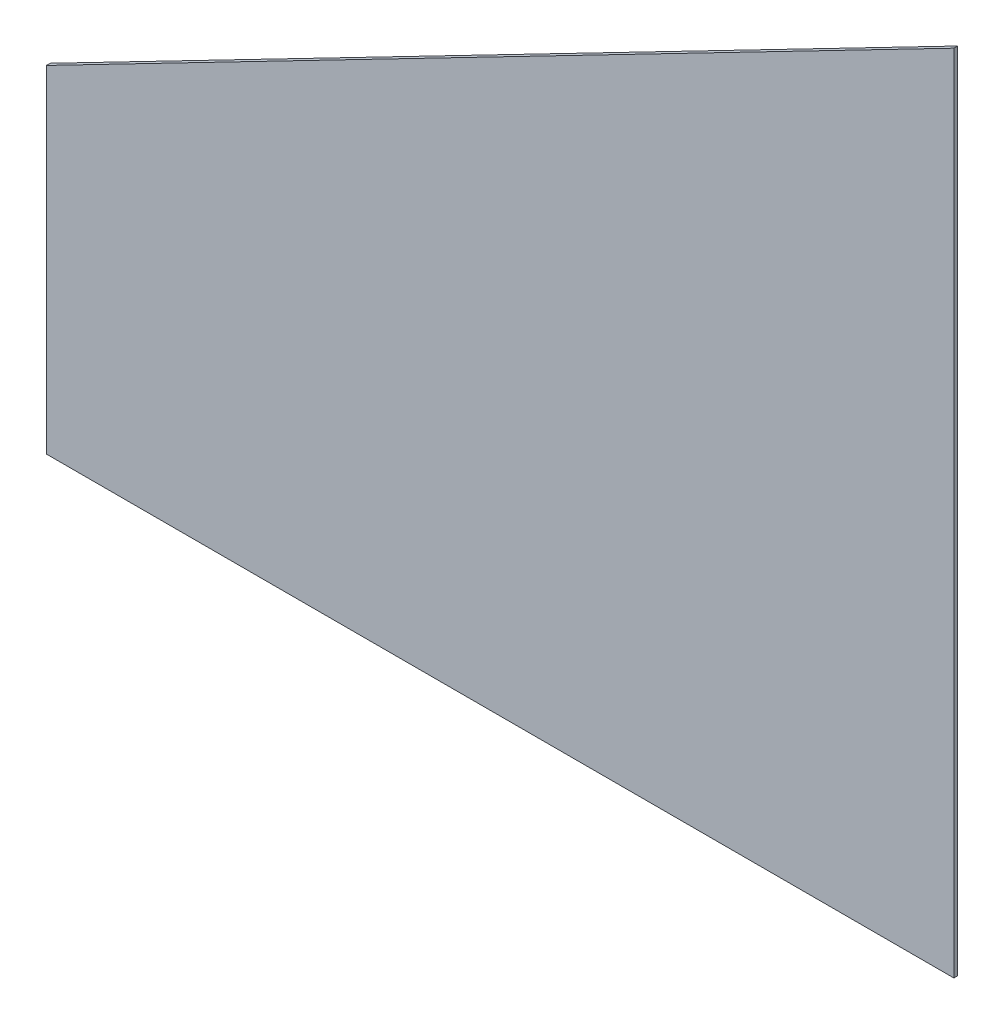
ISO-10303-21;
HEADER;
FILE_DESCRIPTION(('STEP AP214'),'2;1');
FILE_NAME('part.step','',(''),(''),'','','');
FILE_SCHEMA(('AUTOMOTIVE_DESIGN { 1 0 10303 214 1 1 1 1 }'));
ENDSEC;
DATA;
#1=APPLICATION_CONTEXT('core data for automotive mechanical design processes');
#2=APPLICATION_PROTOCOL_DEFINITION('international standard','automotive_design',2000,#1);
#3=PRODUCT_CONTEXT('',#1,'mechanical');
#4=PRODUCT('Part','Part','',(#3));
#5=PRODUCT_RELATED_PRODUCT_CATEGORY('part','',(#4));
#6=PRODUCT_DEFINITION_FORMATION('','',#4);
#7=PRODUCT_DEFINITION_CONTEXT('part definition',#1,'design');
#8=PRODUCT_DEFINITION('design','',#6,#7);
#9=PRODUCT_DEFINITION_SHAPE('','',#8);
#10=(LENGTH_UNIT() NAMED_UNIT(*) SI_UNIT(.MILLI.,.METRE.));
#11=(NAMED_UNIT(*) PLANE_ANGLE_UNIT() SI_UNIT($,.RADIAN.));
#12=(NAMED_UNIT(*) SI_UNIT($,.STERADIAN.) SOLID_ANGLE_UNIT());
#13=UNCERTAINTY_MEASURE_WITH_UNIT(LENGTH_MEASURE(1.E-05),#10,'distance_accuracy_value','');
#14=(GEOMETRIC_REPRESENTATION_CONTEXT(3) GLOBAL_UNCERTAINTY_ASSIGNED_CONTEXT((#13)) GLOBAL_UNIT_ASSIGNED_CONTEXT((#10,
#11,#12)) REPRESENTATION_CONTEXT('',''));
#15=CARTESIAN_POINT('',(0.,0.,0.));
#16=DIRECTION('',(0.,0.,1.));
#17=DIRECTION('',(1.,0.,0.));
#18=AXIS2_PLACEMENT_3D('',#15,#16,#17);
#19=CARTESIAN_POINT('',(0.,50.8,-12192.));
#20=DIRECTION('',(1.,0.,0.));
#21=DIRECTION('',(0.,0.,-1.));
#22=AXIS2_PLACEMENT_3D('',#19,#20,#21);
#23=PLANE('',#22);
#24=DIRECTION('',(0.,0.,1.));
#25=VECTOR('',#24,1.);
#26=CARTESIAN_POINT('',(0.,50.8,-12192.));
#27=LINE('',#26,#25);
#28=CARTESIAN_POINT('',(0.,50.8,-12242.8));
#29=VERTEX_POINT('',#28);
#30=CARTESIAN_POINT('',(0.,50.8,-12192.));
#31=VERTEX_POINT('',#30);
#32=EDGE_CURVE('E86',#29,#31,#27,.T.);
#33=ORIENTED_EDGE('',*,*,#32,.T.);
#34=DIRECTION('',(0.,-1.,0.));
#35=VECTOR('',#34,1.);
#36=CARTESIAN_POINT('',(0.,0.,-12192.));
#37=LINE('',#36,#35);
#38=CARTESIAN_POINT('',(4.7679880361686E-12,4572.,-12192.));
#39=VERTEX_POINT('',#38);
#40=EDGE_CURVE('E51',#39,#31,#37,.T.);
#41=ORIENTED_EDGE('',*,*,#40,.F.);
#42=DIRECTION('',(0.,0.,-1.));
#43=VECTOR('',#42,1.);
#44=CARTESIAN_POINT('',(0.,4572.,-12192.));
#45=LINE('',#44,#43);
#46=CARTESIAN_POINT('',(0.,4572.,-12242.8));
#47=VERTEX_POINT('',#46);
#48=EDGE_CURVE('E38',#39,#47,#45,.T.);
#49=ORIENTED_EDGE('',*,*,#48,.T.);
#50=DIRECTION('',(0.,1.,0.));
#51=VECTOR('',#50,1.);
#52=CARTESIAN_POINT('',(0.,0.,-12242.8));
#53=LINE('',#52,#51);
#54=EDGE_CURVE('E83',#29,#47,#53,.T.);
#55=ORIENTED_EDGE('',*,*,#54,.F.);
#56=EDGE_LOOP('',(#33,#41,#49,#55));
#57=FACE_BOUND('',#56,.T.);
#58=ADVANCED_FACE('F34',(#57),#23,.F.);
#59=CARTESIAN_POINT('',(0.,50.8,0.));
#60=DIRECTION('',(0.,1.,0.));
#61=DIRECTION('',(0.,0.,1.));
#62=AXIS2_PLACEMENT_3D('',#59,#60,#61);
#63=PLANE('',#62);
#64=DIRECTION('',(-1.,0.,0.));
#65=VECTOR('',#64,1.);
#66=CARTESIAN_POINT('',(0.,50.8,-12192.));
#67=LINE('',#66,#65);
#68=CARTESIAN_POINT('',(12192.,50.8,-12192.));
#69=VERTEX_POINT('',#68);
#70=EDGE_CURVE('E80',#69,#31,#67,.T.);
#71=ORIENTED_EDGE('',*,*,#70,.T.);
#72=ORIENTED_EDGE('',*,*,#32,.F.);
#73=DIRECTION('',(-1.,0.,0.));
#74=VECTOR('',#73,1.);
#75=CARTESIAN_POINT('',(0.,50.8,-12242.8));
#76=LINE('',#75,#74);
#77=CARTESIAN_POINT('',(12192.,50.8,-12242.8));
#78=VERTEX_POINT('',#77);
#79=EDGE_CURVE('E95',#78,#29,#76,.T.);
#80=ORIENTED_EDGE('',*,*,#79,.F.);
#81=DIRECTION('',(0.,0.,-1.));
#82=VECTOR('',#81,1.);
#83=CARTESIAN_POINT('',(12192.,50.8,0.));
#84=LINE('',#83,#82);
#85=EDGE_CURVE('E92',#69,#78,#84,.T.);
#86=ORIENTED_EDGE('',*,*,#85,.F.);
#87=EDGE_LOOP('',(#71,#72,#80,#86));
#88=FACE_BOUND('',#87,.T.);
#89=ADVANCED_FACE('F91',(#88),#63,.F.);
#90=CARTESIAN_POINT('',(4.7679880361686E-12,4572.,-12192.));
#91=DIRECTION('',(0.458883686879013,-0.888496348848055,0.));
#92=DIRECTION('',(0.888496348848055,0.458883686879013,0.));
#93=AXIS2_PLACEMENT_3D('',#90,#91,#92);
#94=PLANE('',#93);
#95=DIRECTION('',(0.888496348848055,0.458883686879013,0.));
#96=VECTOR('',#95,1.);
#97=CARTESIAN_POINT('',(-1864.07974810505,3609.25458348143,-12242.8));
#98=LINE('',#97,#96);
#99=CARTESIAN_POINT('',(12192.,10868.8293766007,-12242.8));
#100=VERTEX_POINT('',#99);
#101=EDGE_CURVE('E97',#47,#100,#98,.T.);
#102=ORIENTED_EDGE('',*,*,#101,.F.);
#103=ORIENTED_EDGE('',*,*,#48,.F.);
#104=DIRECTION('',(0.888496348848055,0.458883686879013,0.));
#105=VECTOR('',#104,1.);
#106=CARTESIAN_POINT('',(0.,4572.,-12192.));
#107=LINE('',#106,#105);
#108=CARTESIAN_POINT('',(12192.,10868.8293766007,-12192.));
#109=VERTEX_POINT('',#108);
#110=EDGE_CURVE('E81',#39,#109,#107,.T.);
#111=ORIENTED_EDGE('',*,*,#110,.T.);
#112=DIRECTION('',(0.,0.,1.));
#113=VECTOR('',#112,1.);
#114=CARTESIAN_POINT('',(12192.,10868.8293766007,0.));
#115=LINE('',#114,#113);
#116=EDGE_CURVE('E58',#100,#109,#115,.T.);
#117=ORIENTED_EDGE('',*,*,#116,.F.);
#118=EDGE_LOOP('',(#102,#103,#111,#117));
#119=FACE_BOUND('',#118,.T.);
#120=ADVANCED_FACE('F109',(#119),#94,.F.);
#121=CARTESIAN_POINT('',(0.,0.,-12192.));
#122=DIRECTION('',(0.,0.,1.));
#123=DIRECTION('',(1.,0.,0.));
#124=AXIS2_PLACEMENT_3D('',#121,#122,#123);
#125=PLANE('',#124);
#126=DIRECTION('',(0.,-1.,0.));
#127=VECTOR('',#126,1.);
#128=CARTESIAN_POINT('',(12192.,0.,-12192.));
#129=LINE('',#128,#127);
#130=EDGE_CURVE('E11',#109,#69,#129,.T.);
#131=ORIENTED_EDGE('',*,*,#130,.F.);
#132=ORIENTED_EDGE('',*,*,#110,.F.);
#133=ORIENTED_EDGE('',*,*,#40,.T.);
#134=ORIENTED_EDGE('',*,*,#70,.F.);
#135=EDGE_LOOP('',(#131,#132,#133,#134));
#136=FACE_BOUND('',#135,.T.);
#137=ADVANCED_FACE('F78',(#136),#125,.T.);
#138=CARTESIAN_POINT('',(0.,0.,-12242.8));
#139=DIRECTION('',(0.,0.,1.));
#140=DIRECTION('',(1.,0.,0.));
#141=AXIS2_PLACEMENT_3D('',#138,#139,#140);
#142=PLANE('',#141);
#143=ORIENTED_EDGE('',*,*,#54,.T.);
#144=ORIENTED_EDGE('',*,*,#101,.T.);
#145=DIRECTION('',(0.,-1.,0.));
#146=VECTOR('',#145,1.);
#147=CARTESIAN_POINT('',(12192.,0.,-12242.8));
#148=LINE('',#147,#146);
#149=EDGE_CURVE('E43',#100,#78,#148,.T.);
#150=ORIENTED_EDGE('',*,*,#149,.T.);
#151=ORIENTED_EDGE('',*,*,#79,.T.);
#152=EDGE_LOOP('',(#143,#144,#150,#151));
#153=FACE_BOUND('',#152,.T.);
#154=ADVANCED_FACE('F106',(#153),#142,.F.);
#155=CARTESIAN_POINT('',(12192.,50.8,0.));
#156=DIRECTION('',(-1.,0.,0.));
#157=DIRECTION('',(0.,0.,1.));
#158=AXIS2_PLACEMENT_3D('',#155,#156,#157);
#159=PLANE('',#158);
#160=ORIENTED_EDGE('',*,*,#130,.T.);
#161=ORIENTED_EDGE('',*,*,#85,.T.);
#162=ORIENTED_EDGE('',*,*,#149,.F.);
#163=ORIENTED_EDGE('',*,*,#116,.T.);
#164=EDGE_LOOP('',(#160,#161,#162,#163));
#165=FACE_BOUND('',#164,.T.);
#166=ADVANCED_FACE('F36',(#165),#159,.F.);
#167=CLOSED_SHELL('',(#58,#89,#120,#137,#154,#166));
#168=MANIFOLD_SOLID_BREP('B2',#167);
#169=ADVANCED_BREP_SHAPE_REPRESENTATION('',(#18,#168),#14);
#170=SHAPE_DEFINITION_REPRESENTATION(#9,#169);
ENDSEC;
END-ISO-10303-21;
